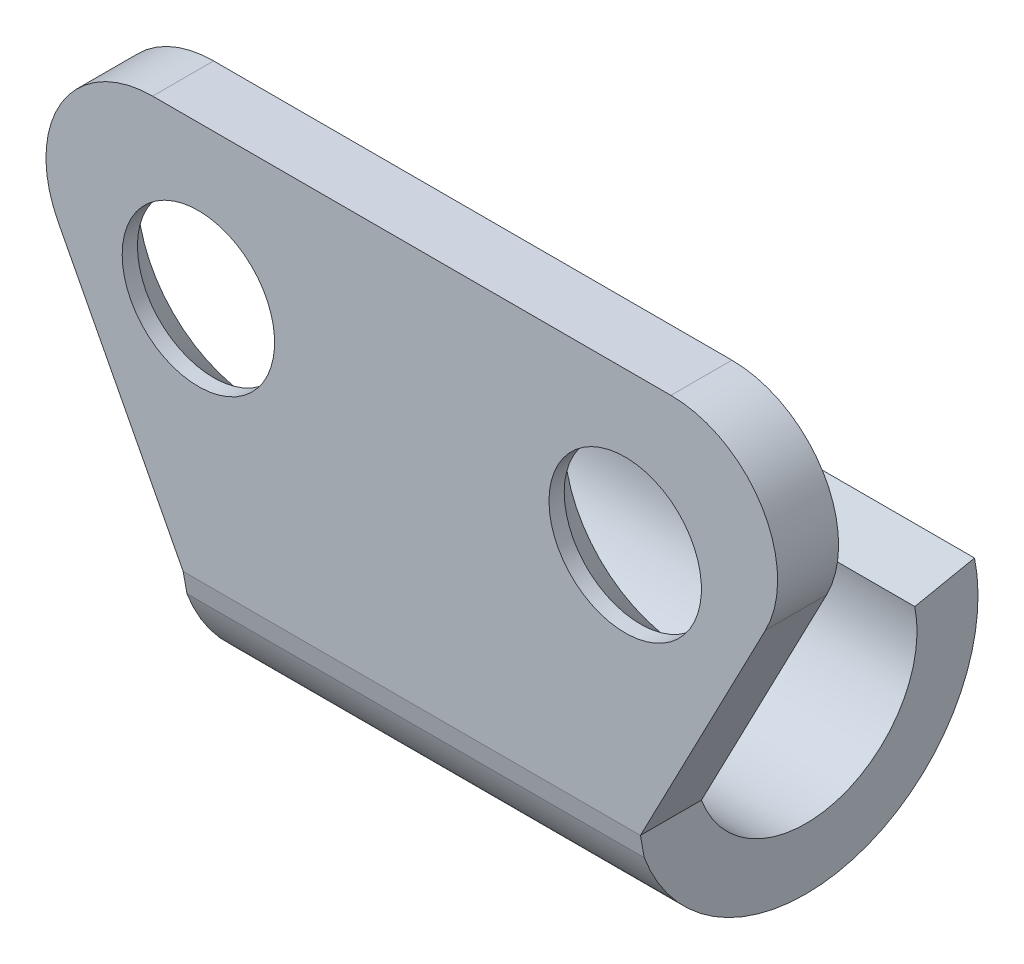
ISO-10303-21;
HEADER;
FILE_DESCRIPTION(('STEP AP214'),'2;1');
FILE_NAME('part.step','',(''),(''),'','','');
FILE_SCHEMA(('AUTOMOTIVE_DESIGN { 1 0 10303 214 1 1 1 1 }'));
ENDSEC;
DATA;
#1=APPLICATION_CONTEXT('core data for automotive mechanical design processes');
#2=APPLICATION_PROTOCOL_DEFINITION('international standard','automotive_design',2000,#1);
#3=PRODUCT_CONTEXT('',#1,'mechanical');
#4=PRODUCT('Part','Part','',(#3));
#5=PRODUCT_RELATED_PRODUCT_CATEGORY('part','',(#4));
#6=PRODUCT_DEFINITION_FORMATION('','',#4);
#7=PRODUCT_DEFINITION_CONTEXT('part definition',#1,'design');
#8=PRODUCT_DEFINITION('design','',#6,#7);
#9=PRODUCT_DEFINITION_SHAPE('','',#8);
#10=(LENGTH_UNIT() NAMED_UNIT(*) SI_UNIT(.MILLI.,.METRE.));
#11=(NAMED_UNIT(*) PLANE_ANGLE_UNIT() SI_UNIT($,.RADIAN.));
#12=(NAMED_UNIT(*) SI_UNIT($,.STERADIAN.) SOLID_ANGLE_UNIT());
#13=UNCERTAINTY_MEASURE_WITH_UNIT(LENGTH_MEASURE(1.E-05),#10,'distance_accuracy_value','');
#14=(GEOMETRIC_REPRESENTATION_CONTEXT(3) GLOBAL_UNCERTAINTY_ASSIGNED_CONTEXT((#13)) GLOBAL_UNIT_ASSIGNED_CONTEXT((#10,
#11,#12)) REPRESENTATION_CONTEXT('',''));
#15=CARTESIAN_POINT('',(0.,0.,0.));
#16=DIRECTION('',(0.,0.,1.));
#17=DIRECTION('',(1.,0.,0.));
#18=AXIS2_PLACEMENT_3D('',#15,#16,#17);
#19=CARTESIAN_POINT('',(7.49999999999954,6.5,0.));
#20=DIRECTION('',(0.,0.,-1.));
#21=DIRECTION('',(1.,0.,0.));
#22=AXIS2_PLACEMENT_3D('',#19,#20,#21);
#23=PLANE('',#22);
#24=CARTESIAN_POINT('',(14.4999999999995,8.,0.));
#25=DIRECTION('',(0.,0.,1.));
#26=DIRECTION('',(1.,0.,0.));
#27=AXIS2_PLACEMENT_3D('',#24,#25,#26);
#28=CIRCLE('',#27,2.5);
#29=CARTESIAN_POINT('',(11.9999999999995,8.,0.));
#30=VERTEX_POINT('',#29);
#31=EDGE_CURVE('E185',#30,#30,#28,.T.);
#32=ORIENTED_EDGE('',*,*,#31,.F.);
#33=EDGE_LOOP('',(#32));
#34=FACE_BOUND('',#33,.T.);
#35=CARTESIAN_POINT('',(0.499999999999537,8.,0.));
#36=DIRECTION('',(0.,0.,1.));
#37=DIRECTION('',(1.,0.,0.));
#38=AXIS2_PLACEMENT_3D('',#35,#36,#37);
#39=CIRCLE('',#38,2.5);
#40=CARTESIAN_POINT('',(-2.00000000000046,8.,0.));
#41=VERTEX_POINT('',#40);
#42=EDGE_CURVE('E223',#41,#41,#39,.T.);
#43=ORIENTED_EDGE('',*,*,#42,.F.);
#44=EDGE_LOOP('',(#43));
#45=FACE_BOUND('',#44,.T.);
#46=DIRECTION('',(1.,0.,0.));
#47=VECTOR('',#46,1.);
#48=CARTESIAN_POINT('',(0.,0.,0.));
#49=LINE('',#48,#47);
#50=CARTESIAN_POINT('',(0.,0.,0.));
#51=VERTEX_POINT('',#50);
#52=CARTESIAN_POINT('',(15.,0.,0.));
#53=VERTEX_POINT('',#52);
#54=EDGE_CURVE('E195',#51,#53,#49,.T.);
#55=ORIENTED_EDGE('',*,*,#54,.T.);
#56=DIRECTION('',(-0.461788431970542,-0.886990103720548,0.));
#57=VECTOR('',#56,1.);
#58=CARTESIAN_POINT('',(19.1044653630215,7.88374048810319,0.));
#59=LINE('',#58,#57);
#60=CARTESIAN_POINT('',(19.1044653630215,7.88374048810319,0.));
#61=VERTEX_POINT('',#60);
#62=EDGE_CURVE('E54',#61,#53,#59,.T.);
#63=ORIENTED_EDGE('',*,*,#62,.F.);
#64=CARTESIAN_POINT('',(15.9999999999995,9.5,0.));
#65=DIRECTION('',(0.,0.,1.));
#66=DIRECTION('',(0.886990103720562,-0.461788431970515,0.));
#67=AXIS2_PLACEMENT_3D('',#64,#65,#66);
#68=CIRCLE('',#67,3.5);
#69=CARTESIAN_POINT('',(15.9999999999995,13.,0.));
#70=VERTEX_POINT('',#69);
#71=EDGE_CURVE('E146',#61,#70,#68,.T.);
#72=ORIENTED_EDGE('',*,*,#71,.T.);
#73=DIRECTION('',(-1.,0.,0.));
#74=VECTOR('',#73,1.);
#75=CARTESIAN_POINT('',(15.9999999999995,13.,0.));
#76=LINE('',#75,#74);
#77=CARTESIAN_POINT('',(-1.00000000000046,13.,0.));
#78=VERTEX_POINT('',#77);
#79=EDGE_CURVE('E156',#70,#78,#76,.T.);
#80=ORIENTED_EDGE('',*,*,#79,.T.);
#81=CARTESIAN_POINT('',(-1.00000000000046,9.5,0.));
#82=DIRECTION('',(0.,0.,1.));
#83=DIRECTION('',(0.,1.,0.));
#84=AXIS2_PLACEMENT_3D('',#81,#82,#83);
#85=CIRCLE('',#84,3.5);
#86=CARTESIAN_POINT('',(-4.10446536302223,7.88374048810282,0.));
#87=VERTEX_POINT('',#86);
#88=EDGE_CURVE('E196',#78,#87,#85,.T.);
#89=ORIENTED_EDGE('',*,*,#88,.T.);
#90=DIRECTION('',(-0.461788431970623,0.886990103720506,0.));
#91=VECTOR('',#90,1.);
#92=CARTESIAN_POINT('',(0.,0.,0.));
#93=LINE('',#92,#91);
#94=EDGE_CURVE('E228',#51,#87,#93,.T.);
#95=ORIENTED_EDGE('',*,*,#94,.F.);
#96=EDGE_LOOP('',(#55,#63,#72,#80,#89,#95));
#97=FACE_BOUND('',#96,.T.);
#98=ADVANCED_FACE('F43',(#34,#45,#97),#23,.F.);
#99=CARTESIAN_POINT('',(7.49999999999954,6.5,-2.));
#100=DIRECTION('',(0.,0.,-1.));
#101=DIRECTION('',(1.,0.,0.));
#102=AXIS2_PLACEMENT_3D('',#99,#100,#101);
#103=PLANE('',#102);
#104=CARTESIAN_POINT('',(14.4999999999995,8.,-2.));
#105=DIRECTION('',(0.,0.,-1.));
#106=DIRECTION('',(1.,0.,0.));
#107=AXIS2_PLACEMENT_3D('',#104,#105,#106);
#108=CIRCLE('',#107,4.);
#109=CARTESIAN_POINT('',(10.4999999999995,8.,-2.));
#110=VERTEX_POINT('',#109);
#111=EDGE_CURVE('E220',#110,#110,#108,.T.);
#112=ORIENTED_EDGE('',*,*,#111,.F.);
#113=EDGE_LOOP('',(#112));
#114=FACE_BOUND('',#113,.T.);
#115=CARTESIAN_POINT('',(0.499999999999537,8.,-2.));
#116=DIRECTION('',(0.,0.,-1.));
#117=DIRECTION('',(1.,0.,0.));
#118=AXIS2_PLACEMENT_3D('',#115,#116,#117);
#119=CIRCLE('',#118,4.);
#120=CARTESIAN_POINT('',(-3.50000000000046,8.,-2.));
#121=VERTEX_POINT('',#120);
#122=EDGE_CURVE('E246',#121,#121,#119,.T.);
#123=ORIENTED_EDGE('',*,*,#122,.F.);
#124=EDGE_LOOP('',(#123));
#125=FACE_BOUND('',#124,.T.);
#126=DIRECTION('',(1.,0.,0.));
#127=VECTOR('',#126,1.);
#128=CARTESIAN_POINT('',(0.,0.,-2.));
#129=LINE('',#128,#127);
#130=CARTESIAN_POINT('',(0.,0.,-2.));
#131=VERTEX_POINT('',#130);
#132=CARTESIAN_POINT('',(15.,0.,-2.));
#133=VERTEX_POINT('',#132);
#134=EDGE_CURVE('E244',#131,#133,#129,.T.);
#135=ORIENTED_EDGE('',*,*,#134,.F.);
#136=DIRECTION('',(0.461788431970623,-0.886990103720506,0.));
#137=VECTOR('',#136,1.);
#138=CARTESIAN_POINT('',(0.,0.,-2.));
#139=LINE('',#138,#137);
#140=CARTESIAN_POINT('',(-4.10446536302223,7.88374048810282,-2.));
#141=VERTEX_POINT('',#140);
#142=EDGE_CURVE('E224',#141,#131,#139,.T.);
#143=ORIENTED_EDGE('',*,*,#142,.F.);
#144=CARTESIAN_POINT('',(-1.00000000000046,9.5,-2.));
#145=DIRECTION('',(0.,0.,1.));
#146=DIRECTION('',(0.,1.,0.));
#147=AXIS2_PLACEMENT_3D('',#144,#145,#146);
#148=CIRCLE('',#147,3.5);
#149=CARTESIAN_POINT('',(-1.00000000000046,13.,-2.));
#150=VERTEX_POINT('',#149);
#151=EDGE_CURVE('E198',#150,#141,#148,.T.);
#152=ORIENTED_EDGE('',*,*,#151,.F.);
#153=DIRECTION('',(-1.,0.,0.));
#154=VECTOR('',#153,1.);
#155=CARTESIAN_POINT('',(15.9999999999995,13.,-2.));
#156=LINE('',#155,#154);
#157=CARTESIAN_POINT('',(15.9999999999995,13.,-2.));
#158=VERTEX_POINT('',#157);
#159=EDGE_CURVE('E152',#158,#150,#156,.T.);
#160=ORIENTED_EDGE('',*,*,#159,.F.);
#161=CARTESIAN_POINT('',(15.9999999999995,9.5,-2.));
#162=DIRECTION('',(0.,0.,1.));
#163=DIRECTION('',(0.886990103720562,-0.461788431970515,0.));
#164=AXIS2_PLACEMENT_3D('',#161,#162,#163);
#165=CIRCLE('',#164,3.5);
#166=CARTESIAN_POINT('',(19.1044653630215,7.88374048810319,-2.));
#167=VERTEX_POINT('',#166);
#168=EDGE_CURVE('E149',#167,#158,#165,.T.);
#169=ORIENTED_EDGE('',*,*,#168,.F.);
#170=DIRECTION('',(0.461788431970542,0.886990103720548,0.));
#171=VECTOR('',#170,1.);
#172=CARTESIAN_POINT('',(19.1044653630215,7.88374048810319,-2.));
#173=LINE('',#172,#171);
#174=EDGE_CURVE('E11',#133,#167,#173,.T.);
#175=ORIENTED_EDGE('',*,*,#174,.F.);
#176=EDGE_LOOP('',(#135,#143,#152,#160,#169,#175));
#177=FACE_BOUND('',#176,.T.);
#178=ADVANCED_FACE('F310',(#114,#125,#177),#103,.T.);
#179=CARTESIAN_POINT('',(15.,0.,0.));
#180=DIRECTION('',(0.886990103720548,-0.461788431970542,0.));
#181=DIRECTION('',(0.,0.,1.));
#182=AXIS2_PLACEMENT_3D('',#179,#180,#181);
#183=PLANE('',#182);
#184=ORIENTED_EDGE('',*,*,#62,.T.);
#185=DIRECTION('',(0.,0.,-1.));
#186=VECTOR('',#185,1.);
#187=CARTESIAN_POINT('',(15.,0.,0.));
#188=LINE('',#187,#186);
#189=EDGE_CURVE('E217',#53,#133,#188,.T.);
#190=ORIENTED_EDGE('',*,*,#189,.T.);
#191=ORIENTED_EDGE('',*,*,#174,.T.);
#192=DIRECTION('',(0.,0.,-1.));
#193=VECTOR('',#192,1.);
#194=CARTESIAN_POINT('',(19.1044653630215,7.88374048810319,0.));
#195=LINE('',#194,#193);
#196=EDGE_CURVE('E63',#61,#167,#195,.T.);
#197=ORIENTED_EDGE('',*,*,#196,.F.);
#198=EDGE_LOOP('',(#184,#190,#191,#197));
#199=FACE_BOUND('',#198,.T.);
#200=ADVANCED_FACE('F45',(#199),#183,.T.);
#201=CARTESIAN_POINT('',(15.9999999999995,9.5,0.));
#202=DIRECTION('',(0.,0.,-1.));
#203=DIRECTION('',(0.886990103720562,-0.461788431970515,0.));
#204=AXIS2_PLACEMENT_3D('',#201,#202,#203);
#205=CYLINDRICAL_SURFACE('',#204,3.5);
#206=ORIENTED_EDGE('',*,*,#71,.F.);
#207=ORIENTED_EDGE('',*,*,#196,.T.);
#208=ORIENTED_EDGE('',*,*,#168,.T.);
#209=DIRECTION('',(0.,0.,-1.));
#210=VECTOR('',#209,1.);
#211=CARTESIAN_POINT('',(15.9999999999995,13.,0.));
#212=LINE('',#211,#210);
#213=EDGE_CURVE('E143',#70,#158,#212,.T.);
#214=ORIENTED_EDGE('',*,*,#213,.F.);
#215=EDGE_LOOP('',(#206,#207,#208,#214));
#216=FACE_BOUND('',#215,.T.);
#217=ADVANCED_FACE('F144',(#216),#205,.T.);
#218=CARTESIAN_POINT('',(15.9999999999995,13.,0.));
#219=DIRECTION('',(0.,1.,0.));
#220=DIRECTION('',(1.,0.,0.));
#221=AXIS2_PLACEMENT_3D('',#218,#219,#220);
#222=PLANE('',#221);
#223=ORIENTED_EDGE('',*,*,#79,.F.);
#224=ORIENTED_EDGE('',*,*,#213,.T.);
#225=ORIENTED_EDGE('',*,*,#159,.T.);
#226=DIRECTION('',(0.,0.,-1.));
#227=VECTOR('',#226,1.);
#228=CARTESIAN_POINT('',(-1.00000000000046,13.,0.));
#229=LINE('',#228,#227);
#230=EDGE_CURVE('E158',#78,#150,#229,.T.);
#231=ORIENTED_EDGE('',*,*,#230,.F.);
#232=EDGE_LOOP('',(#223,#224,#225,#231));
#233=FACE_BOUND('',#232,.T.);
#234=ADVANCED_FACE('F157',(#233),#222,.T.);
#235=CARTESIAN_POINT('',(-1.00000000000046,9.5,0.));
#236=DIRECTION('',(0.,0.,-1.));
#237=DIRECTION('',(0.,1.,0.));
#238=AXIS2_PLACEMENT_3D('',#235,#236,#237);
#239=CYLINDRICAL_SURFACE('',#238,3.5);
#240=ORIENTED_EDGE('',*,*,#88,.F.);
#241=ORIENTED_EDGE('',*,*,#230,.T.);
#242=ORIENTED_EDGE('',*,*,#151,.T.);
#243=DIRECTION('',(0.,0.,-1.));
#244=VECTOR('',#243,1.);
#245=CARTESIAN_POINT('',(-4.10446536302223,7.88374048810282,0.));
#246=LINE('',#245,#244);
#247=EDGE_CURVE('E199',#87,#141,#246,.T.);
#248=ORIENTED_EDGE('',*,*,#247,.F.);
#249=EDGE_LOOP('',(#240,#241,#242,#248));
#250=FACE_BOUND('',#249,.T.);
#251=ADVANCED_FACE('F283',(#250),#239,.T.);
#252=CARTESIAN_POINT('',(-4.10446536302223,7.88374048810282,0.));
#253=DIRECTION('',(-0.886990103720506,-0.461788431970623,0.));
#254=DIRECTION('',(-0.461788431970623,0.886990103720506,0.));
#255=AXIS2_PLACEMENT_3D('',#252,#253,#254);
#256=PLANE('',#255);
#257=ORIENTED_EDGE('',*,*,#94,.T.);
#258=ORIENTED_EDGE('',*,*,#247,.T.);
#259=ORIENTED_EDGE('',*,*,#142,.T.);
#260=DIRECTION('',(0.,0.,-1.));
#261=VECTOR('',#260,1.);
#262=CARTESIAN_POINT('',(0.,0.,0.));
#263=LINE('',#262,#261);
#264=EDGE_CURVE('E178',#51,#131,#263,.T.);
#265=ORIENTED_EDGE('',*,*,#264,.F.);
#266=EDGE_LOOP('',(#257,#258,#259,#265));
#267=FACE_BOUND('',#266,.T.);
#268=ADVANCED_FACE('F281',(#267),#256,.T.);
#269=CARTESIAN_POINT('',(15.,-0.990415019243716,-5.53682533459405));
#270=DIRECTION('',(-1.,0.,0.));
#271=DIRECTION('',(0.,0.,-1.));
#272=AXIS2_PLACEMENT_3D('',#269,#270,#271);
#273=PLANE('',#272);
#274=CARTESIAN_POINT('',(15.,1.27037201768333,-5.42275093830455));
#275=DIRECTION('',(-1.,0.,0.));
#276=DIRECTION('',(0.,-0.347961355097498,0.937508877482615));
#277=AXIS2_PLACEMENT_3D('',#274,#275,#276);
#278=CIRCLE('',#277,5.65089973088356);
#279=CARTESIAN_POINT('',(15.,2.39969767471279,-10.9596536220145));
#280=VERTEX_POINT('',#279);
#281=CARTESIAN_POINT('',(15.,-0.695922710194997,-0.124982274837092));
#282=VERTEX_POINT('',#281);
#283=EDGE_CURVE('E174',#280,#282,#278,.T.);
#284=ORIENTED_EDGE('',*,*,#283,.F.);
#285=DIRECTION('',(0.,0.199848822455195,-0.979826743951844));
#286=VECTOR('',#285,1.);
#287=CARTESIAN_POINT('',(15.,2.39969767471279,-10.9596536220145));
#288=LINE('',#287,#286);
#289=CARTESIAN_POINT('',(15.,2.00000002980232,-9.00000013411045));
#290=VERTEX_POINT('',#289);
#291=EDGE_CURVE('E188',#290,#280,#288,.T.);
#292=ORIENTED_EDGE('',*,*,#291,.F.);
#293=CARTESIAN_POINT('',(15.,1.27037201768333,-5.42275093830455));
#294=DIRECTION('',(1.,0.,0.));
#295=DIRECTION('',(0.,-0.347961355097498,0.937508877482615));
#296=AXIS2_PLACEMENT_3D('',#293,#294,#295);
#297=CIRCLE('',#296,3.65089973088356);
#298=EDGE_CURVE('E241',#133,#290,#297,.T.);
#299=ORIENTED_EDGE('',*,*,#298,.F.);
#300=ORIENTED_EDGE('',*,*,#189,.F.);
#301=DIRECTION('',(0.,0.984253231798474,0.176764181027322));
#302=VECTOR('',#301,1.);
#303=CARTESIAN_POINT('',(15.,-0.695922710194997,-0.124982274837092));
#304=LINE('',#303,#302);
#305=EDGE_CURVE('E191',#282,#53,#304,.T.);
#306=ORIENTED_EDGE('',*,*,#305,.F.);
#307=EDGE_LOOP('',(#284,#292,#299,#300,#306));
#308=FACE_BOUND('',#307,.T.);
#309=ADVANCED_FACE('F335',(#308),#273,.F.);
#310=CARTESIAN_POINT('',(0.,-0.990415019243716,-5.53682533459405));
#311=DIRECTION('',(-1.,0.,0.));
#312=DIRECTION('',(0.,0.,-1.));
#313=AXIS2_PLACEMENT_3D('',#310,#311,#312);
#314=PLANE('',#313);
#315=CARTESIAN_POINT('',(0.,1.27037201768333,-5.42275093830455));
#316=DIRECTION('',(1.,0.,0.));
#317=DIRECTION('',(0.,-0.347961355097498,0.937508877482615));
#318=AXIS2_PLACEMENT_3D('',#315,#316,#317);
#319=CIRCLE('',#318,5.65089973088356);
#320=CARTESIAN_POINT('',(0.,-0.695922710194997,-0.124982274837092));
#321=VERTEX_POINT('',#320);
#322=CARTESIAN_POINT('',(0.,2.39969767471279,-10.9596536220145));
#323=VERTEX_POINT('',#322);
#324=EDGE_CURVE('E179',#321,#323,#319,.T.);
#325=ORIENTED_EDGE('',*,*,#324,.F.);
#326=DIRECTION('',(0.,0.984253231798474,0.176764181027322));
#327=VECTOR('',#326,1.);
#328=CARTESIAN_POINT('',(0.,-0.695922710194997,-0.124982274837092));
#329=LINE('',#328,#327);
#330=EDGE_CURVE('E231',#321,#51,#329,.T.);
#331=ORIENTED_EDGE('',*,*,#330,.T.);
#332=ORIENTED_EDGE('',*,*,#264,.T.);
#333=CARTESIAN_POINT('',(0.,1.27037201768333,-5.42275093830455));
#334=DIRECTION('',(1.,0.,0.));
#335=DIRECTION('',(0.,-0.347961355097498,0.937508877482615));
#336=AXIS2_PLACEMENT_3D('',#333,#334,#335);
#337=CIRCLE('',#336,3.65089973088356);
#338=CARTESIAN_POINT('',(0.,2.00000002980232,-9.00000013411045));
#339=VERTEX_POINT('',#338);
#340=EDGE_CURVE('E245',#131,#339,#337,.T.);
#341=ORIENTED_EDGE('',*,*,#340,.T.);
#342=DIRECTION('',(0.,-0.199848822455195,0.979826743951844));
#343=VECTOR('',#342,1.);
#344=CARTESIAN_POINT('',(0.,2.39969767471279,-10.9596536220145));
#345=LINE('',#344,#343);
#346=EDGE_CURVE('E182',#323,#339,#345,.T.);
#347=ORIENTED_EDGE('',*,*,#346,.F.);
#348=EDGE_LOOP('',(#325,#331,#332,#341,#347));
#349=FACE_BOUND('',#348,.T.);
#350=ADVANCED_FACE('F328',(#349),#314,.T.);
#351=CARTESIAN_POINT('',(0.,1.27037201768333,-5.42275093830455));
#352=DIRECTION('',(1.,0.,0.));
#353=DIRECTION('',(0.,-0.347961355097498,0.937508877482615));
#354=AXIS2_PLACEMENT_3D('',#351,#352,#353);
#355=CYLINDRICAL_SURFACE('',#354,5.65089973088356);
#356=ORIENTED_EDGE('',*,*,#324,.T.);
#357=DIRECTION('',(1.,0.,0.));
#358=VECTOR('',#357,1.);
#359=CARTESIAN_POINT('',(0.,2.39969767471279,-10.9596536220145));
#360=LINE('',#359,#358);
#361=EDGE_CURVE('E126',#323,#280,#360,.T.);
#362=ORIENTED_EDGE('',*,*,#361,.T.);
#363=ORIENTED_EDGE('',*,*,#283,.T.);
#364=DIRECTION('',(1.,0.,0.));
#365=VECTOR('',#364,1.);
#366=CARTESIAN_POINT('',(0.,-0.695922710194997,-0.124982274837092));
#367=LINE('',#366,#365);
#368=EDGE_CURVE('E194',#321,#282,#367,.T.);
#369=ORIENTED_EDGE('',*,*,#368,.F.);
#370=EDGE_LOOP('',(#356,#362,#363,#369));
#371=FACE_BOUND('',#370,.T.);
#372=ADVANCED_FACE('F324',(#371),#355,.T.);
#373=CARTESIAN_POINT('',(0.,-0.695922710194997,-0.124982274837092));
#374=DIRECTION('',(0.,-0.176764181027322,0.984253231798474));
#375=DIRECTION('',(0.,-0.984253231798474,-0.176764181027322));
#376=AXIS2_PLACEMENT_3D('',#373,#374,#375);
#377=PLANE('',#376);
#378=ORIENTED_EDGE('',*,*,#330,.F.);
#379=ORIENTED_EDGE('',*,*,#368,.T.);
#380=ORIENTED_EDGE('',*,*,#305,.T.);
#381=ORIENTED_EDGE('',*,*,#54,.F.);
#382=EDGE_LOOP('',(#378,#379,#380,#381));
#383=FACE_BOUND('',#382,.T.);
#384=ADVANCED_FACE('F327',(#383),#377,.T.);
#385=CARTESIAN_POINT('',(0.,1.27037201768333,-5.42275093830455));
#386=DIRECTION('',(1.,0.,0.));
#387=DIRECTION('',(0.,-0.347961355097498,0.937508877482615));
#388=AXIS2_PLACEMENT_3D('',#385,#386,#387);
#389=CYLINDRICAL_SURFACE('',#388,3.65089973088356);
#390=ORIENTED_EDGE('',*,*,#340,.F.);
#391=ORIENTED_EDGE('',*,*,#134,.T.);
#392=ORIENTED_EDGE('',*,*,#298,.T.);
#393=DIRECTION('',(1.,0.,0.));
#394=VECTOR('',#393,1.);
#395=CARTESIAN_POINT('',(0.,2.00000002980232,-9.00000013411045));
#396=LINE('',#395,#394);
#397=EDGE_CURVE('E132',#339,#290,#396,.T.);
#398=ORIENTED_EDGE('',*,*,#397,.F.);
#399=EDGE_LOOP('',(#390,#391,#392,#398));
#400=FACE_BOUND('',#399,.T.);
#401=ADVANCED_FACE('F320',(#400),#389,.F.);
#402=CARTESIAN_POINT('',(0.,2.00000002980232,-9.00000013411045));
#403=DIRECTION('',(0.,0.979826743951844,0.199848822455195));
#404=DIRECTION('',(-1.,0.,0.));
#405=AXIS2_PLACEMENT_3D('',#402,#403,#404);
#406=PLANE('',#405);
#407=ORIENTED_EDGE('',*,*,#346,.T.);
#408=ORIENTED_EDGE('',*,*,#397,.T.);
#409=ORIENTED_EDGE('',*,*,#291,.T.);
#410=ORIENTED_EDGE('',*,*,#361,.F.);
#411=EDGE_LOOP('',(#407,#408,#409,#410));
#412=FACE_BOUND('',#411,.T.);
#413=ADVANCED_FACE('F349',(#412),#406,.T.);
#414=CARTESIAN_POINT('',(14.4999999999995,8.,-0.9));
#415=DIRECTION('',(0.,0.,1.));
#416=DIRECTION('',(1.,0.,0.));
#417=AXIS2_PLACEMENT_3D('',#414,#415,#416);
#418=CYLINDRICAL_SURFACE('',#417,2.5);
#419=CARTESIAN_POINT('',(14.4999999999995,8.,-0.5));
#420=DIRECTION('',(0.,0.,-1.));
#421=DIRECTION('',(1.,0.,0.));
#422=AXIS2_PLACEMENT_3D('',#419,#420,#421);
#423=CIRCLE('',#422,2.5);
#424=CARTESIAN_POINT('',(11.9999999999995,8.,-0.5));
#425=VERTEX_POINT('',#424);
#426=EDGE_CURVE('E47',#425,#425,#423,.T.);
#427=ORIENTED_EDGE('',*,*,#426,.T.);
#428=DIRECTION('',(0.,0.,1.));
#429=VECTOR('',#428,1.);
#430=CARTESIAN_POINT('',(11.9999999999995,8.,-0.9));
#431=LINE('',#430,#429);
#432=EDGE_CURVE('E202',#425,#30,#431,.T.);
#433=ORIENTED_EDGE('',*,*,#432,.T.);
#434=ORIENTED_EDGE('',*,*,#31,.T.);
#435=ORIENTED_EDGE('',*,*,#432,.F.);
#436=EDGE_LOOP('',(#427,#433,#434,#435));
#437=FACE_BOUND('',#436,.T.);
#438=ADVANCED_FACE('F352',(#437),#418,.F.);
#439=CARTESIAN_POINT('',(14.4999999999995,8.,-1.25));
#440=DIRECTION('',(0.,0.,-1.));
#441=DIRECTION('',(1.,0.,0.));
#442=AXIS2_PLACEMENT_3D('',#439,#440,#441);
#443=CONICAL_SURFACE('',#442,3.25,0.785398163397448);
#444=ORIENTED_EDGE('',*,*,#111,.T.);
#445=DIRECTION('',(0.707106781186547,0.,0.707106781186548));
#446=VECTOR('',#445,1.);
#447=CARTESIAN_POINT('',(11.2499999999995,8.,-1.25));
#448=LINE('',#447,#446);
#449=EDGE_CURVE('E117',#110,#425,#448,.T.);
#450=ORIENTED_EDGE('',*,*,#449,.T.);
#451=ORIENTED_EDGE('',*,*,#426,.F.);
#452=ORIENTED_EDGE('',*,*,#449,.F.);
#453=EDGE_LOOP('',(#444,#450,#451,#452));
#454=FACE_BOUND('',#453,.T.);
#455=ADVANCED_FACE('F332',(#454),#443,.F.);
#456=CARTESIAN_POINT('',(0.499999999999537,8.,-0.9));
#457=DIRECTION('',(0.,0.,1.));
#458=DIRECTION('',(1.,0.,0.));
#459=AXIS2_PLACEMENT_3D('',#456,#457,#458);
#460=CYLINDRICAL_SURFACE('',#459,2.5);
#461=CARTESIAN_POINT('',(0.499999999999537,8.,-0.5));
#462=DIRECTION('',(0.,0.,-1.));
#463=DIRECTION('',(1.,0.,0.));
#464=AXIS2_PLACEMENT_3D('',#461,#462,#463);
#465=CIRCLE('',#464,2.5);
#466=CARTESIAN_POINT('',(-2.00000000000046,8.,-0.5));
#467=VERTEX_POINT('',#466);
#468=EDGE_CURVE('E234',#467,#467,#465,.T.);
#469=ORIENTED_EDGE('',*,*,#468,.T.);
#470=DIRECTION('',(0.,0.,1.));
#471=VECTOR('',#470,1.);
#472=CARTESIAN_POINT('',(-2.00000000000046,8.,-0.9));
#473=LINE('',#472,#471);
#474=EDGE_CURVE('E110',#467,#41,#473,.T.);
#475=ORIENTED_EDGE('',*,*,#474,.T.);
#476=ORIENTED_EDGE('',*,*,#42,.T.);
#477=ORIENTED_EDGE('',*,*,#474,.F.);
#478=EDGE_LOOP('',(#469,#475,#476,#477));
#479=FACE_BOUND('',#478,.T.);
#480=ADVANCED_FACE('F299',(#479),#460,.F.);
#481=CARTESIAN_POINT('',(0.499999999999537,8.,-1.25));
#482=DIRECTION('',(0.,0.,-1.));
#483=DIRECTION('',(1.,0.,0.));
#484=AXIS2_PLACEMENT_3D('',#481,#482,#483);
#485=CONICAL_SURFACE('',#484,3.25,0.785398163397448);
#486=ORIENTED_EDGE('',*,*,#122,.T.);
#487=DIRECTION('',(0.707106781186547,0.,0.707106781186548));
#488=VECTOR('',#487,1.);
#489=CARTESIAN_POINT('',(-2.75000000000046,8.,-1.25));
#490=LINE('',#489,#488);
#491=EDGE_CURVE('E237',#121,#467,#490,.T.);
#492=ORIENTED_EDGE('',*,*,#491,.T.);
#493=ORIENTED_EDGE('',*,*,#468,.F.);
#494=ORIENTED_EDGE('',*,*,#491,.F.);
#495=EDGE_LOOP('',(#486,#492,#493,#494));
#496=FACE_BOUND('',#495,.T.);
#497=ADVANCED_FACE('F297',(#496),#485,.F.);
#498=CLOSED_SHELL('',(#98,#178,#200,#217,#234,#251,#268,#309,#350,#372,#384,#401,#413,#438,#455,
#480,#497));
#499=MANIFOLD_SOLID_BREP('B2',#498);
#500=ADVANCED_BREP_SHAPE_REPRESENTATION('',(#18,#499),#14);
#501=SHAPE_DEFINITION_REPRESENTATION(#9,#500);
ENDSEC;
END-ISO-10303-21;
